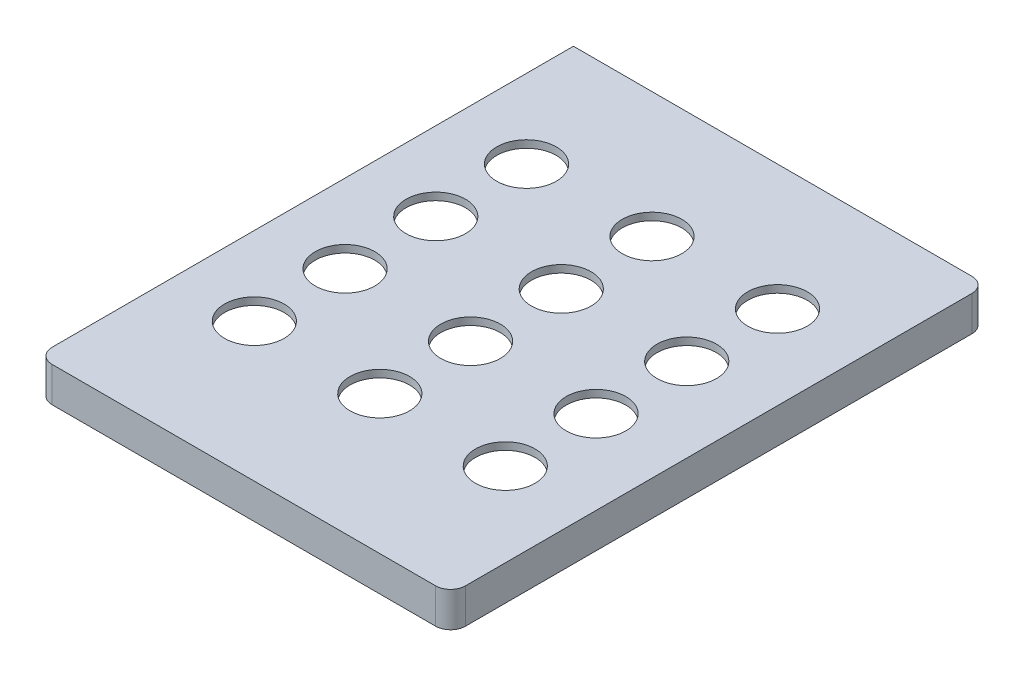
ISO-10303-21;
HEADER;
FILE_DESCRIPTION(('STEP AP214'),'2;1');
FILE_NAME('part.step','',(''),(''),'','','');
FILE_SCHEMA(('AUTOMOTIVE_DESIGN { 1 0 10303 214 1 1 1 1 }'));
ENDSEC;
DATA;
#1=APPLICATION_CONTEXT('core data for automotive mechanical design processes');
#2=APPLICATION_PROTOCOL_DEFINITION('international standard','automotive_design',2000,#1);
#3=PRODUCT_CONTEXT('',#1,'mechanical');
#4=PRODUCT('Part','Part','',(#3));
#5=PRODUCT_RELATED_PRODUCT_CATEGORY('part','',(#4));
#6=PRODUCT_DEFINITION_FORMATION('','',#4);
#7=PRODUCT_DEFINITION_CONTEXT('part definition',#1,'design');
#8=PRODUCT_DEFINITION('design','',#6,#7);
#9=PRODUCT_DEFINITION_SHAPE('','',#8);
#10=(LENGTH_UNIT() NAMED_UNIT(*) SI_UNIT(.MILLI.,.METRE.));
#11=(NAMED_UNIT(*) PLANE_ANGLE_UNIT() SI_UNIT($,.RADIAN.));
#12=(NAMED_UNIT(*) SI_UNIT($,.STERADIAN.) SOLID_ANGLE_UNIT());
#13=UNCERTAINTY_MEASURE_WITH_UNIT(LENGTH_MEASURE(1.E-05),#10,'distance_accuracy_value','');
#14=(GEOMETRIC_REPRESENTATION_CONTEXT(3) GLOBAL_UNCERTAINTY_ASSIGNED_CONTEXT((#13)) GLOBAL_UNIT_ASSIGNED_CONTEXT((#10,
#11,#12)) REPRESENTATION_CONTEXT('',''));
#15=CARTESIAN_POINT('',(0.,0.,0.));
#16=DIRECTION('',(0.,0.,1.));
#17=DIRECTION('',(1.,0.,0.));
#18=AXIS2_PLACEMENT_3D('',#15,#16,#17);
#19=CARTESIAN_POINT('',(25.75,12.5,-34.));
#20=DIRECTION('',(0.,1.,0.));
#21=DIRECTION('',(0.,0.,1.));
#22=AXIS2_PLACEMENT_3D('',#19,#20,#21);
#23=PLANE('',#22);
#24=CARTESIAN_POINT('',(25.75,12.5,-34.));
#25=DIRECTION('',(0.,1.,0.));
#26=DIRECTION('',(0.,0.,1.));
#27=AXIS2_PLACEMENT_3D('',#24,#25,#26);
#28=CIRCLE('',#27,2.);
#29=CARTESIAN_POINT('',(27.75,12.5,-34.));
#30=VERTEX_POINT('',#29);
#31=CARTESIAN_POINT('',(25.75,12.5,-36.));
#32=VERTEX_POINT('',#31);
#33=EDGE_CURVE('E194',#30,#32,#28,.T.);
#34=ORIENTED_EDGE('',*,*,#33,.F.);
#35=DIRECTION('',(0.,0.,-1.));
#36=VECTOR('',#35,1.);
#37=CARTESIAN_POINT('',(27.75,12.5,34.));
#38=LINE('',#37,#36);
#39=CARTESIAN_POINT('',(27.75,12.5,34.));
#40=VERTEX_POINT('',#39);
#41=EDGE_CURVE('E56',#40,#30,#38,.T.);
#42=ORIENTED_EDGE('',*,*,#41,.F.);
#43=CARTESIAN_POINT('',(25.75,12.5,34.));
#44=DIRECTION('',(0.,1.,0.));
#45=DIRECTION('',(0.,0.,1.));
#46=AXIS2_PLACEMENT_3D('',#43,#44,#45);
#47=CIRCLE('',#46,2.);
#48=CARTESIAN_POINT('',(25.75,12.5,36.));
#49=VERTEX_POINT('',#48);
#50=EDGE_CURVE('E205',#49,#40,#47,.T.);
#51=ORIENTED_EDGE('',*,*,#50,.F.);
#52=DIRECTION('',(1.,0.,0.));
#53=VECTOR('',#52,1.);
#54=CARTESIAN_POINT('',(-25.75,12.5,36.));
#55=LINE('',#54,#53);
#56=CARTESIAN_POINT('',(-25.75,12.5,36.));
#57=VERTEX_POINT('',#56);
#58=EDGE_CURVE('E203',#57,#49,#55,.T.);
#59=ORIENTED_EDGE('',*,*,#58,.F.);
#60=CARTESIAN_POINT('',(-25.75,12.5,34.));
#61=DIRECTION('',(0.,1.,0.));
#62=DIRECTION('',(0.,0.,1.));
#63=AXIS2_PLACEMENT_3D('',#60,#61,#62);
#64=CIRCLE('',#63,2.);
#65=CARTESIAN_POINT('',(-27.75,12.5,34.));
#66=VERTEX_POINT('',#65);
#67=EDGE_CURVE('E126',#66,#57,#64,.T.);
#68=ORIENTED_EDGE('',*,*,#67,.F.);
#69=DIRECTION('',(0.,0.,1.));
#70=VECTOR('',#69,1.);
#71=CARTESIAN_POINT('',(-27.75,12.5,-18.75));
#72=LINE('',#71,#70);
#73=CARTESIAN_POINT('',(-27.75,12.5,-36.));
#74=VERTEX_POINT('',#73);
#75=EDGE_CURVE('E200',#74,#66,#72,.T.);
#76=ORIENTED_EDGE('',*,*,#75,.F.);
#77=DIRECTION('',(-1.,0.,0.));
#78=VECTOR('',#77,1.);
#79=CARTESIAN_POINT('',(25.75,12.5,-36.));
#80=LINE('',#79,#78);
#81=EDGE_CURVE('E197',#32,#74,#80,.T.);
#82=ORIENTED_EDGE('',*,*,#81,.F.);
#83=EDGE_LOOP('',(#34,#42,#51,#59,#68,#76,#82));
#84=FACE_BOUND('',#83,.T.);
#85=DIRECTION('',(-1.,0.,0.));
#86=VECTOR('',#85,1.);
#87=CARTESIAN_POINT('',(-26.5,12.5,-34.));
#88=LINE('',#87,#86);
#89=CARTESIAN_POINT('',(25.45,12.5,-34.));
#90=VERTEX_POINT('',#89);
#91=CARTESIAN_POINT('',(-26.5,12.5,-34.));
#92=VERTEX_POINT('',#91);
#93=EDGE_CURVE('E48',#90,#92,#88,.T.);
#94=ORIENTED_EDGE('',*,*,#93,.T.);
#95=DIRECTION('',(0.,0.,1.));
#96=VECTOR('',#95,1.);
#97=CARTESIAN_POINT('',(-26.5,12.5,-34.));
#98=LINE('',#97,#96);
#99=CARTESIAN_POINT('',(-26.5,12.5,30.5));
#100=VERTEX_POINT('',#99);
#101=EDGE_CURVE('E179',#92,#100,#98,.T.);
#102=ORIENTED_EDGE('',*,*,#101,.T.);
#103=DIRECTION('',(1.,0.,0.));
#104=VECTOR('',#103,1.);
#105=CARTESIAN_POINT('',(25.45,12.5,30.5));
#106=LINE('',#105,#104);
#107=CARTESIAN_POINT('',(25.45,12.5,30.5));
#108=VERTEX_POINT('',#107);
#109=EDGE_CURVE('E182',#100,#108,#106,.T.);
#110=ORIENTED_EDGE('',*,*,#109,.T.);
#111=DIRECTION('',(0.,0.,-1.));
#112=VECTOR('',#111,1.);
#113=CARTESIAN_POINT('',(25.45,12.5,-34.));
#114=LINE('',#113,#112);
#115=EDGE_CURVE('E168',#108,#90,#114,.T.);
#116=ORIENTED_EDGE('',*,*,#115,.T.);
#117=EDGE_LOOP('',(#94,#102,#110,#116));
#118=FACE_BOUND('',#117,.T.);
#119=ADVANCED_FACE('F33',(#84,#118),#23,.F.);
#120=CARTESIAN_POINT('',(25.75,16.2,-34.));
#121=DIRECTION('',(0.,-1.,0.));
#122=DIRECTION('',(0.,0.,-1.));
#123=AXIS2_PLACEMENT_3D('',#120,#121,#122);
#124=CYLINDRICAL_SURFACE('',#123,2.);
#125=ORIENTED_EDGE('',*,*,#33,.T.);
#126=DIRECTION('',(0.,-1.,0.));
#127=VECTOR('',#126,1.);
#128=CARTESIAN_POINT('',(25.75,16.2,-36.));
#129=LINE('',#128,#127);
#130=CARTESIAN_POINT('',(25.75,17.2,-36.));
#131=VERTEX_POINT('',#130);
#132=EDGE_CURVE('E11',#131,#32,#129,.T.);
#133=ORIENTED_EDGE('',*,*,#132,.F.);
#134=CARTESIAN_POINT('',(25.75,17.2,-34.));
#135=DIRECTION('',(0.,1.,0.));
#136=DIRECTION('',(0.,0.,1.));
#137=AXIS2_PLACEMENT_3D('',#134,#135,#136);
#138=CIRCLE('',#137,2.);
#139=CARTESIAN_POINT('',(27.75,17.2,-34.));
#140=VERTEX_POINT('',#139);
#141=EDGE_CURVE('E158',#140,#131,#138,.T.);
#142=ORIENTED_EDGE('',*,*,#141,.F.);
#143=DIRECTION('',(0.,-1.,0.));
#144=VECTOR('',#143,1.);
#145=CARTESIAN_POINT('',(27.75,16.2,-34.));
#146=LINE('',#145,#144);
#147=EDGE_CURVE('E208',#140,#30,#146,.T.);
#148=ORIENTED_EDGE('',*,*,#147,.T.);
#149=EDGE_LOOP('',(#125,#133,#142,#148));
#150=FACE_BOUND('',#149,.T.);
#151=ADVANCED_FACE('F35',(#150),#124,.T.);
#152=CARTESIAN_POINT('',(25.75,16.2,-36.));
#153=DIRECTION('',(0.,0.,1.));
#154=DIRECTION('',(1.,0.,0.));
#155=AXIS2_PLACEMENT_3D('',#152,#153,#154);
#156=PLANE('',#155);
#157=ORIENTED_EDGE('',*,*,#81,.T.);
#158=DIRECTION('',(0.,-1.,0.));
#159=VECTOR('',#158,1.);
#160=CARTESIAN_POINT('',(-27.75,16.2,-36.));
#161=LINE('',#160,#159);
#162=CARTESIAN_POINT('',(-27.75,17.2,-36.));
#163=VERTEX_POINT('',#162);
#164=EDGE_CURVE('E41',#163,#74,#161,.T.);
#165=ORIENTED_EDGE('',*,*,#164,.F.);
#166=DIRECTION('',(-1.,0.,0.));
#167=VECTOR('',#166,1.);
#168=CARTESIAN_POINT('',(25.75,17.2,-36.));
#169=LINE('',#168,#167);
#170=EDGE_CURVE('E161',#131,#163,#169,.T.);
#171=ORIENTED_EDGE('',*,*,#170,.F.);
#172=ORIENTED_EDGE('',*,*,#132,.T.);
#173=EDGE_LOOP('',(#157,#165,#171,#172));
#174=FACE_BOUND('',#173,.T.);
#175=ADVANCED_FACE('F218',(#174),#156,.F.);
#176=CARTESIAN_POINT('',(-27.75,16.2,-18.75));
#177=DIRECTION('',(1.,0.,0.));
#178=DIRECTION('',(0.,0.,-1.));
#179=AXIS2_PLACEMENT_3D('',#176,#177,#178);
#180=PLANE('',#179);
#181=ORIENTED_EDGE('',*,*,#75,.T.);
#182=DIRECTION('',(0.,-1.,0.));
#183=VECTOR('',#182,1.);
#184=CARTESIAN_POINT('',(-27.75,16.2,34.));
#185=LINE('',#184,#183);
#186=CARTESIAN_POINT('',(-27.75,17.2,34.));
#187=VERTEX_POINT('',#186);
#188=EDGE_CURVE('E129',#187,#66,#185,.T.);
#189=ORIENTED_EDGE('',*,*,#188,.F.);
#190=DIRECTION('',(0.,0.,1.));
#191=VECTOR('',#190,1.);
#192=CARTESIAN_POINT('',(-27.75,17.2,-36.));
#193=LINE('',#192,#191);
#194=EDGE_CURVE('E146',#163,#187,#193,.T.);
#195=ORIENTED_EDGE('',*,*,#194,.F.);
#196=ORIENTED_EDGE('',*,*,#164,.T.);
#197=EDGE_LOOP('',(#181,#189,#195,#196));
#198=FACE_BOUND('',#197,.T.);
#199=ADVANCED_FACE('F215',(#198),#180,.F.);
#200=CARTESIAN_POINT('',(-25.75,16.2,34.));
#201=DIRECTION('',(0.,-1.,0.));
#202=DIRECTION('',(0.,0.,-1.));
#203=AXIS2_PLACEMENT_3D('',#200,#201,#202);
#204=CYLINDRICAL_SURFACE('',#203,2.);
#205=ORIENTED_EDGE('',*,*,#67,.T.);
#206=DIRECTION('',(0.,-1.,0.));
#207=VECTOR('',#206,1.);
#208=CARTESIAN_POINT('',(-25.75,16.2,36.));
#209=LINE('',#208,#207);
#210=CARTESIAN_POINT('',(-25.75,17.2,36.));
#211=VERTEX_POINT('',#210);
#212=EDGE_CURVE('E119',#211,#57,#209,.T.);
#213=ORIENTED_EDGE('',*,*,#212,.F.);
#214=CARTESIAN_POINT('',(-25.75,17.2,34.));
#215=DIRECTION('',(0.,1.,0.));
#216=DIRECTION('',(0.,0.,1.));
#217=AXIS2_PLACEMENT_3D('',#214,#215,#216);
#218=CIRCLE('',#217,2.);
#219=EDGE_CURVE('E124',#187,#211,#218,.T.);
#220=ORIENTED_EDGE('',*,*,#219,.F.);
#221=ORIENTED_EDGE('',*,*,#188,.T.);
#222=EDGE_LOOP('',(#205,#213,#220,#221));
#223=FACE_BOUND('',#222,.T.);
#224=ADVANCED_FACE('F121',(#223),#204,.T.);
#225=CARTESIAN_POINT('',(-25.75,16.2,36.));
#226=DIRECTION('',(0.,0.,-1.));
#227=DIRECTION('',(-1.,0.,0.));
#228=AXIS2_PLACEMENT_3D('',#225,#226,#227);
#229=PLANE('',#228);
#230=ORIENTED_EDGE('',*,*,#58,.T.);
#231=DIRECTION('',(0.,-1.,0.));
#232=VECTOR('',#231,1.);
#233=CARTESIAN_POINT('',(25.75,16.2,36.));
#234=LINE('',#233,#232);
#235=CARTESIAN_POINT('',(25.75,17.2,36.));
#236=VERTEX_POINT('',#235);
#237=EDGE_CURVE('E130',#236,#49,#234,.T.);
#238=ORIENTED_EDGE('',*,*,#237,.F.);
#239=DIRECTION('',(1.,0.,0.));
#240=VECTOR('',#239,1.);
#241=CARTESIAN_POINT('',(-25.75,17.2,36.));
#242=LINE('',#241,#240);
#243=EDGE_CURVE('E133',#211,#236,#242,.T.);
#244=ORIENTED_EDGE('',*,*,#243,.F.);
#245=ORIENTED_EDGE('',*,*,#212,.T.);
#246=EDGE_LOOP('',(#230,#238,#244,#245));
#247=FACE_BOUND('',#246,.T.);
#248=ADVANCED_FACE('F134',(#247),#229,.F.);
#249=CARTESIAN_POINT('',(25.75,16.2,34.));
#250=DIRECTION('',(0.,-1.,0.));
#251=DIRECTION('',(0.,0.,-1.));
#252=AXIS2_PLACEMENT_3D('',#249,#250,#251);
#253=CYLINDRICAL_SURFACE('',#252,2.);
#254=ORIENTED_EDGE('',*,*,#50,.T.);
#255=DIRECTION('',(0.,-1.,0.));
#256=VECTOR('',#255,1.);
#257=CARTESIAN_POINT('',(27.75,16.2,34.));
#258=LINE('',#257,#256);
#259=CARTESIAN_POINT('',(27.75,17.2,34.));
#260=VERTEX_POINT('',#259);
#261=EDGE_CURVE('E210',#260,#40,#258,.T.);
#262=ORIENTED_EDGE('',*,*,#261,.F.);
#263=CARTESIAN_POINT('',(25.75,17.2,34.));
#264=DIRECTION('',(0.,1.,0.));
#265=DIRECTION('',(0.,0.,1.));
#266=AXIS2_PLACEMENT_3D('',#263,#264,#265);
#267=CIRCLE('',#266,2.);
#268=EDGE_CURVE('E139',#236,#260,#267,.T.);
#269=ORIENTED_EDGE('',*,*,#268,.F.);
#270=ORIENTED_EDGE('',*,*,#237,.T.);
#271=EDGE_LOOP('',(#254,#262,#269,#270));
#272=FACE_BOUND('',#271,.T.);
#273=ADVANCED_FACE('F227',(#272),#253,.T.);
#274=CARTESIAN_POINT('',(27.75,16.2,34.));
#275=DIRECTION('',(-1.,0.,0.));
#276=DIRECTION('',(0.,0.,1.));
#277=AXIS2_PLACEMENT_3D('',#274,#275,#276);
#278=PLANE('',#277);
#279=ORIENTED_EDGE('',*,*,#41,.T.);
#280=ORIENTED_EDGE('',*,*,#147,.F.);
#281=DIRECTION('',(0.,0.,-1.));
#282=VECTOR('',#281,1.);
#283=CARTESIAN_POINT('',(27.75,17.2,34.));
#284=LINE('',#283,#282);
#285=EDGE_CURVE('E155',#260,#140,#284,.T.);
#286=ORIENTED_EDGE('',*,*,#285,.F.);
#287=ORIENTED_EDGE('',*,*,#261,.T.);
#288=EDGE_LOOP('',(#279,#280,#286,#287));
#289=FACE_BOUND('',#288,.T.);
#290=ADVANCED_FACE('F228',(#289),#278,.F.);
#291=CARTESIAN_POINT('',(-26.5,16.2,-34.));
#292=DIRECTION('',(0.,0.,1.));
#293=DIRECTION('',(1.,0.,0.));
#294=AXIS2_PLACEMENT_3D('',#291,#292,#293);
#295=PLANE('',#294);
#296=ORIENTED_EDGE('',*,*,#93,.F.);
#297=DIRECTION('',(0.,-1.,0.));
#298=VECTOR('',#297,1.);
#299=CARTESIAN_POINT('',(25.45,16.2,-34.));
#300=LINE('',#299,#298);
#301=CARTESIAN_POINT('',(25.45,16.2,-34.));
#302=VERTEX_POINT('',#301);
#303=EDGE_CURVE('E177',#302,#90,#300,.T.);
#304=ORIENTED_EDGE('',*,*,#303,.F.);
#305=DIRECTION('',(-1.,0.,0.));
#306=VECTOR('',#305,1.);
#307=CARTESIAN_POINT('',(-26.5,16.2,-34.));
#308=LINE('',#307,#306);
#309=CARTESIAN_POINT('',(-26.5,16.2,-34.));
#310=VERTEX_POINT('',#309);
#311=EDGE_CURVE('E164',#302,#310,#308,.T.);
#312=ORIENTED_EDGE('',*,*,#311,.T.);
#313=DIRECTION('',(0.,-1.,0.));
#314=VECTOR('',#313,1.);
#315=CARTESIAN_POINT('',(-26.5,16.2,-34.));
#316=LINE('',#315,#314);
#317=EDGE_CURVE('E192',#310,#92,#316,.T.);
#318=ORIENTED_EDGE('',*,*,#317,.T.);
#319=EDGE_LOOP('',(#296,#304,#312,#318));
#320=FACE_BOUND('',#319,.T.);
#321=ADVANCED_FACE('F230',(#320),#295,.T.);
#322=CARTESIAN_POINT('',(-26.5,16.2,-34.));
#323=DIRECTION('',(1.,0.,0.));
#324=DIRECTION('',(0.,0.,-1.));
#325=AXIS2_PLACEMENT_3D('',#322,#323,#324);
#326=PLANE('',#325);
#327=ORIENTED_EDGE('',*,*,#101,.F.);
#328=ORIENTED_EDGE('',*,*,#317,.F.);
#329=DIRECTION('',(0.,0.,1.));
#330=VECTOR('',#329,1.);
#331=CARTESIAN_POINT('',(-26.5,16.2,-34.));
#332=LINE('',#331,#330);
#333=CARTESIAN_POINT('',(-26.5,16.2,30.5));
#334=VERTEX_POINT('',#333);
#335=EDGE_CURVE('E167',#310,#334,#332,.T.);
#336=ORIENTED_EDGE('',*,*,#335,.T.);
#337=DIRECTION('',(0.,-1.,0.));
#338=VECTOR('',#337,1.);
#339=CARTESIAN_POINT('',(-26.5,16.2,30.5));
#340=LINE('',#339,#338);
#341=EDGE_CURVE('E190',#334,#100,#340,.T.);
#342=ORIENTED_EDGE('',*,*,#341,.T.);
#343=EDGE_LOOP('',(#327,#328,#336,#342));
#344=FACE_BOUND('',#343,.T.);
#345=ADVANCED_FACE('F236',(#344),#326,.T.);
#346=CARTESIAN_POINT('',(25.45,16.2,30.5));
#347=DIRECTION('',(0.,0.,-1.));
#348=DIRECTION('',(-1.,0.,0.));
#349=AXIS2_PLACEMENT_3D('',#346,#347,#348);
#350=PLANE('',#349);
#351=ORIENTED_EDGE('',*,*,#109,.F.);
#352=ORIENTED_EDGE('',*,*,#341,.F.);
#353=DIRECTION('',(1.,0.,0.));
#354=VECTOR('',#353,1.);
#355=CARTESIAN_POINT('',(25.45,16.2,30.5));
#356=LINE('',#355,#354);
#357=CARTESIAN_POINT('',(25.45,16.2,30.5));
#358=VERTEX_POINT('',#357);
#359=EDGE_CURVE('E171',#334,#358,#356,.T.);
#360=ORIENTED_EDGE('',*,*,#359,.T.);
#361=DIRECTION('',(0.,-1.,0.));
#362=VECTOR('',#361,1.);
#363=CARTESIAN_POINT('',(25.45,16.2,30.5));
#364=LINE('',#363,#362);
#365=EDGE_CURVE('E188',#358,#108,#364,.T.);
#366=ORIENTED_EDGE('',*,*,#365,.T.);
#367=EDGE_LOOP('',(#351,#352,#360,#366));
#368=FACE_BOUND('',#367,.T.);
#369=ADVANCED_FACE('F247',(#368),#350,.T.);
#370=CARTESIAN_POINT('',(25.45,16.2,-34.));
#371=DIRECTION('',(-1.,0.,0.));
#372=DIRECTION('',(0.,0.,1.));
#373=AXIS2_PLACEMENT_3D('',#370,#371,#372);
#374=PLANE('',#373);
#375=ORIENTED_EDGE('',*,*,#115,.F.);
#376=ORIENTED_EDGE('',*,*,#365,.F.);
#377=DIRECTION('',(0.,0.,-1.));
#378=VECTOR('',#377,1.);
#379=CARTESIAN_POINT('',(25.45,16.2,-34.));
#380=LINE('',#379,#378);
#381=EDGE_CURVE('E174',#358,#302,#380,.T.);
#382=ORIENTED_EDGE('',*,*,#381,.T.);
#383=ORIENTED_EDGE('',*,*,#303,.T.);
#384=EDGE_LOOP('',(#375,#376,#382,#383));
#385=FACE_BOUND('',#384,.T.);
#386=ADVANCED_FACE('F251',(#385),#374,.T.);
#387=CARTESIAN_POINT('',(-25.75,17.2,34.));
#388=DIRECTION('',(0.,1.,0.));
#389=DIRECTION('',(0.,0.,1.));
#390=AXIS2_PLACEMENT_3D('',#387,#388,#389);
#391=PLANE('',#390);
#392=CARTESIAN_POINT('',(16.5,17.2,-6.96666666666662));
#393=DIRECTION('',(0.,1.,0.));
#394=DIRECTION('',(0.,0.,1.));
#395=AXIS2_PLACEMENT_3D('',#392,#393,#394);
#396=CIRCLE('',#395,4.);
#397=CARTESIAN_POINT('',(16.5,17.2,-2.96666666666663));
#398=VERTEX_POINT('',#397);
#399=EDGE_CURVE('E324',#398,#398,#396,.T.);
#400=ORIENTED_EDGE('',*,*,#399,.F.);
#401=EDGE_LOOP('',(#400));
#402=FACE_BOUND('',#401,.T.);
#403=CARTESIAN_POINT('',(16.5,17.2,17.4));
#404=DIRECTION('',(0.,1.,0.));
#405=DIRECTION('',(0.,0.,1.));
#406=AXIS2_PLACEMENT_3D('',#403,#404,#405);
#407=CIRCLE('',#406,4.);
#408=CARTESIAN_POINT('',(16.5,17.2,21.4));
#409=VERTEX_POINT('',#408);
#410=EDGE_CURVE('E336',#409,#409,#407,.T.);
#411=ORIENTED_EDGE('',*,*,#410,.F.);
#412=EDGE_LOOP('',(#411));
#413=FACE_BOUND('',#412,.T.);
#414=CARTESIAN_POINT('',(-0.350000000000008,17.2,5.2166666666667));
#415=DIRECTION('',(0.,1.,0.));
#416=DIRECTION('',(0.,0.,1.));
#417=AXIS2_PLACEMENT_3D('',#414,#415,#416);
#418=CIRCLE('',#417,4.);
#419=CARTESIAN_POINT('',(-0.350000000000008,17.2,9.2166666666667));
#420=VERTEX_POINT('',#419);
#421=EDGE_CURVE('E348',#420,#420,#418,.T.);
#422=ORIENTED_EDGE('',*,*,#421,.F.);
#423=EDGE_LOOP('',(#422));
#424=FACE_BOUND('',#423,.T.);
#425=CARTESIAN_POINT('',(-0.350000000000007,17.2,-19.15));
#426=DIRECTION('',(0.,1.,0.));
#427=DIRECTION('',(0.,0.,1.));
#428=AXIS2_PLACEMENT_3D('',#425,#426,#427);
#429=CIRCLE('',#428,4.);
#430=CARTESIAN_POINT('',(-0.350000000000007,17.2,-15.15));
#431=VERTEX_POINT('',#430);
#432=EDGE_CURVE('E360',#431,#431,#429,.T.);
#433=ORIENTED_EDGE('',*,*,#432,.F.);
#434=EDGE_LOOP('',(#433));
#435=FACE_BOUND('',#434,.T.);
#436=CARTESIAN_POINT('',(-17.2,17.2,-6.96666666666662));
#437=DIRECTION('',(0.,1.,0.));
#438=DIRECTION('',(0.,0.,1.));
#439=AXIS2_PLACEMENT_3D('',#436,#437,#438);
#440=CIRCLE('',#439,4.);
#441=CARTESIAN_POINT('',(-17.2,17.2,-2.96666666666662));
#442=VERTEX_POINT('',#441);
#443=EDGE_CURVE('E372',#442,#442,#440,.T.);
#444=ORIENTED_EDGE('',*,*,#443,.F.);
#445=EDGE_LOOP('',(#444));
#446=FACE_BOUND('',#445,.T.);
#447=CARTESIAN_POINT('',(-17.2,17.2,17.4));
#448=DIRECTION('',(0.,1.,0.));
#449=DIRECTION('',(0.,0.,1.));
#450=AXIS2_PLACEMENT_3D('',#447,#448,#449);
#451=CIRCLE('',#450,4.);
#452=CARTESIAN_POINT('',(-17.2,17.2,21.4));
#453=VERTEX_POINT('',#452);
#454=EDGE_CURVE('E147',#453,#453,#451,.T.);
#455=ORIENTED_EDGE('',*,*,#454,.F.);
#456=EDGE_LOOP('',(#455));
#457=FACE_BOUND('',#456,.T.);
#458=ORIENTED_EDGE('',*,*,#219,.T.);
#459=ORIENTED_EDGE('',*,*,#243,.T.);
#460=ORIENTED_EDGE('',*,*,#268,.T.);
#461=ORIENTED_EDGE('',*,*,#285,.T.);
#462=ORIENTED_EDGE('',*,*,#141,.T.);
#463=ORIENTED_EDGE('',*,*,#170,.T.);
#464=ORIENTED_EDGE('',*,*,#194,.T.);
#465=EDGE_LOOP('',(#458,#459,#460,#461,#462,#463,#464));
#466=FACE_BOUND('',#465,.T.);
#467=CARTESIAN_POINT('',(-17.2,17.2,5.21666666666671));
#468=DIRECTION('',(0.,1.,0.));
#469=DIRECTION('',(0.,0.,1.));
#470=AXIS2_PLACEMENT_3D('',#467,#468,#469);
#471=CIRCLE('',#470,4.);
#472=CARTESIAN_POINT('',(-17.2,17.2,9.21666666666671));
#473=VERTEX_POINT('',#472);
#474=EDGE_CURVE('E378',#473,#473,#471,.T.);
#475=ORIENTED_EDGE('',*,*,#474,.F.);
#476=EDGE_LOOP('',(#475));
#477=FACE_BOUND('',#476,.T.);
#478=CARTESIAN_POINT('',(-17.2,17.2,-19.15));
#479=DIRECTION('',(0.,1.,0.));
#480=DIRECTION('',(0.,0.,1.));
#481=AXIS2_PLACEMENT_3D('',#478,#479,#480);
#482=CIRCLE('',#481,4.);
#483=CARTESIAN_POINT('',(-17.2,17.2,-15.15));
#484=VERTEX_POINT('',#483);
#485=EDGE_CURVE('E366',#484,#484,#482,.T.);
#486=ORIENTED_EDGE('',*,*,#485,.F.);
#487=EDGE_LOOP('',(#486));
#488=FACE_BOUND('',#487,.T.);
#489=CARTESIAN_POINT('',(-0.350000000000007,17.2,-6.96666666666663));
#490=DIRECTION('',(0.,1.,0.));
#491=DIRECTION('',(0.,0.,1.));
#492=AXIS2_PLACEMENT_3D('',#489,#490,#491);
#493=CIRCLE('',#492,4.);
#494=CARTESIAN_POINT('',(-0.350000000000007,17.2,-2.96666666666663));
#495=VERTEX_POINT('',#494);
#496=EDGE_CURVE('E354',#495,#495,#493,.T.);
#497=ORIENTED_EDGE('',*,*,#496,.F.);
#498=EDGE_LOOP('',(#497));
#499=FACE_BOUND('',#498,.T.);
#500=CARTESIAN_POINT('',(-0.350000000000008,17.2,17.4));
#501=DIRECTION('',(0.,1.,0.));
#502=DIRECTION('',(0.,0.,1.));
#503=AXIS2_PLACEMENT_3D('',#500,#501,#502);
#504=CIRCLE('',#503,4.);
#505=CARTESIAN_POINT('',(-0.350000000000008,17.2,21.4));
#506=VERTEX_POINT('',#505);
#507=EDGE_CURVE('E342',#506,#506,#504,.T.);
#508=ORIENTED_EDGE('',*,*,#507,.F.);
#509=EDGE_LOOP('',(#508));
#510=FACE_BOUND('',#509,.T.);
#511=CARTESIAN_POINT('',(16.5,17.2,5.2166666666667));
#512=DIRECTION('',(0.,1.,0.));
#513=DIRECTION('',(0.,0.,1.));
#514=AXIS2_PLACEMENT_3D('',#511,#512,#513);
#515=CIRCLE('',#514,4.);
#516=CARTESIAN_POINT('',(16.5,17.2,9.2166666666667));
#517=VERTEX_POINT('',#516);
#518=EDGE_CURVE('E330',#517,#517,#515,.T.);
#519=ORIENTED_EDGE('',*,*,#518,.F.);
#520=EDGE_LOOP('',(#519));
#521=FACE_BOUND('',#520,.T.);
#522=CARTESIAN_POINT('',(16.5,17.2,-19.15));
#523=DIRECTION('',(0.,1.,0.));
#524=DIRECTION('',(0.,0.,1.));
#525=AXIS2_PLACEMENT_3D('',#522,#523,#524);
#526=CIRCLE('',#525,4.);
#527=CARTESIAN_POINT('',(16.5,17.2,-15.15));
#528=VERTEX_POINT('',#527);
#529=EDGE_CURVE('E315',#528,#528,#526,.T.);
#530=ORIENTED_EDGE('',*,*,#529,.F.);
#531=EDGE_LOOP('',(#530));
#532=FACE_BOUND('',#531,.T.);
#533=ADVANCED_FACE('F142',(#402,#413,#424,#435,#446,#457,#466,#477,#488,#499,#510,#521,#532),
#391,.T.);
#534=CARTESIAN_POINT('',(-25.75,16.2,34.));
#535=DIRECTION('',(0.,1.,0.));
#536=DIRECTION('',(0.,0.,1.));
#537=AXIS2_PLACEMENT_3D('',#534,#535,#536);
#538=PLANE('',#537);
#539=ORIENTED_EDGE('',*,*,#311,.F.);
#540=ORIENTED_EDGE('',*,*,#381,.F.);
#541=ORIENTED_EDGE('',*,*,#359,.F.);
#542=ORIENTED_EDGE('',*,*,#335,.F.);
#543=EDGE_LOOP('',(#539,#540,#541,#542));
#544=FACE_BOUND('',#543,.T.);
#545=CARTESIAN_POINT('',(16.5,16.2,-6.96666666666662));
#546=DIRECTION('',(0.,1.,0.));
#547=DIRECTION('',(0.,0.,1.));
#548=AXIS2_PLACEMENT_3D('',#545,#546,#547);
#549=CIRCLE('',#548,4.);
#550=CARTESIAN_POINT('',(16.5,16.2,-2.96666666666663));
#551=VERTEX_POINT('',#550);
#552=EDGE_CURVE('E321',#551,#551,#549,.T.);
#553=ORIENTED_EDGE('',*,*,#552,.T.);
#554=EDGE_LOOP('',(#553));
#555=FACE_BOUND('',#554,.T.);
#556=CARTESIAN_POINT('',(16.5,16.2,17.4));
#557=DIRECTION('',(0.,1.,0.));
#558=DIRECTION('',(0.,0.,1.));
#559=AXIS2_PLACEMENT_3D('',#556,#557,#558);
#560=CIRCLE('',#559,4.);
#561=CARTESIAN_POINT('',(16.5,16.2,21.4));
#562=VERTEX_POINT('',#561);
#563=EDGE_CURVE('E333',#562,#562,#560,.T.);
#564=ORIENTED_EDGE('',*,*,#563,.T.);
#565=EDGE_LOOP('',(#564));
#566=FACE_BOUND('',#565,.T.);
#567=CARTESIAN_POINT('',(-0.350000000000008,16.2,5.2166666666667));
#568=DIRECTION('',(0.,1.,0.));
#569=DIRECTION('',(0.,0.,1.));
#570=AXIS2_PLACEMENT_3D('',#567,#568,#569);
#571=CIRCLE('',#570,4.);
#572=CARTESIAN_POINT('',(-0.350000000000008,16.2,9.2166666666667));
#573=VERTEX_POINT('',#572);
#574=EDGE_CURVE('E345',#573,#573,#571,.T.);
#575=ORIENTED_EDGE('',*,*,#574,.T.);
#576=EDGE_LOOP('',(#575));
#577=FACE_BOUND('',#576,.T.);
#578=CARTESIAN_POINT('',(-0.350000000000007,16.2,-19.15));
#579=DIRECTION('',(0.,1.,0.));
#580=DIRECTION('',(0.,0.,1.));
#581=AXIS2_PLACEMENT_3D('',#578,#579,#580);
#582=CIRCLE('',#581,4.);
#583=CARTESIAN_POINT('',(-0.350000000000007,16.2,-15.15));
#584=VERTEX_POINT('',#583);
#585=EDGE_CURVE('E357',#584,#584,#582,.T.);
#586=ORIENTED_EDGE('',*,*,#585,.T.);
#587=EDGE_LOOP('',(#586));
#588=FACE_BOUND('',#587,.T.);
#589=CARTESIAN_POINT('',(-17.2,16.2,-6.96666666666662));
#590=DIRECTION('',(0.,1.,0.));
#591=DIRECTION('',(0.,0.,1.));
#592=AXIS2_PLACEMENT_3D('',#589,#590,#591);
#593=CIRCLE('',#592,4.);
#594=CARTESIAN_POINT('',(-17.2,16.2,-2.96666666666662));
#595=VERTEX_POINT('',#594);
#596=EDGE_CURVE('E369',#595,#595,#593,.T.);
#597=ORIENTED_EDGE('',*,*,#596,.T.);
#598=EDGE_LOOP('',(#597));
#599=FACE_BOUND('',#598,.T.);
#600=CARTESIAN_POINT('',(-17.2,16.2,17.4));
#601=DIRECTION('',(0.,1.,0.));
#602=DIRECTION('',(0.,0.,1.));
#603=AXIS2_PLACEMENT_3D('',#600,#601,#602);
#604=CIRCLE('',#603,4.);
#605=CARTESIAN_POINT('',(-17.2,16.2,21.4));
#606=VERTEX_POINT('',#605);
#607=EDGE_CURVE('E150',#606,#606,#604,.T.);
#608=ORIENTED_EDGE('',*,*,#607,.T.);
#609=EDGE_LOOP('',(#608));
#610=FACE_BOUND('',#609,.T.);
#611=CARTESIAN_POINT('',(-17.2,16.2,5.21666666666671));
#612=DIRECTION('',(0.,1.,0.));
#613=DIRECTION('',(0.,0.,1.));
#614=AXIS2_PLACEMENT_3D('',#611,#612,#613);
#615=CIRCLE('',#614,4.);
#616=CARTESIAN_POINT('',(-17.2,16.2,9.21666666666671));
#617=VERTEX_POINT('',#616);
#618=EDGE_CURVE('E375',#617,#617,#615,.T.);
#619=ORIENTED_EDGE('',*,*,#618,.T.);
#620=EDGE_LOOP('',(#619));
#621=FACE_BOUND('',#620,.T.);
#622=CARTESIAN_POINT('',(-17.2,16.2,-19.15));
#623=DIRECTION('',(0.,1.,0.));
#624=DIRECTION('',(0.,0.,1.));
#625=AXIS2_PLACEMENT_3D('',#622,#623,#624);
#626=CIRCLE('',#625,4.);
#627=CARTESIAN_POINT('',(-17.2,16.2,-15.15));
#628=VERTEX_POINT('',#627);
#629=EDGE_CURVE('E363',#628,#628,#626,.T.);
#630=ORIENTED_EDGE('',*,*,#629,.T.);
#631=EDGE_LOOP('',(#630));
#632=FACE_BOUND('',#631,.T.);
#633=CARTESIAN_POINT('',(-0.350000000000007,16.2,-6.96666666666663));
#634=DIRECTION('',(0.,1.,0.));
#635=DIRECTION('',(0.,0.,1.));
#636=AXIS2_PLACEMENT_3D('',#633,#634,#635);
#637=CIRCLE('',#636,4.);
#638=CARTESIAN_POINT('',(-0.350000000000007,16.2,-2.96666666666663));
#639=VERTEX_POINT('',#638);
#640=EDGE_CURVE('E351',#639,#639,#637,.T.);
#641=ORIENTED_EDGE('',*,*,#640,.T.);
#642=EDGE_LOOP('',(#641));
#643=FACE_BOUND('',#642,.T.);
#644=CARTESIAN_POINT('',(-0.350000000000008,16.2,17.4));
#645=DIRECTION('',(0.,1.,0.));
#646=DIRECTION('',(0.,0.,1.));
#647=AXIS2_PLACEMENT_3D('',#644,#645,#646);
#648=CIRCLE('',#647,4.);
#649=CARTESIAN_POINT('',(-0.350000000000008,16.2,21.4));
#650=VERTEX_POINT('',#649);
#651=EDGE_CURVE('E339',#650,#650,#648,.T.);
#652=ORIENTED_EDGE('',*,*,#651,.T.);
#653=EDGE_LOOP('',(#652));
#654=FACE_BOUND('',#653,.T.);
#655=CARTESIAN_POINT('',(16.5,16.2,5.2166666666667));
#656=DIRECTION('',(0.,1.,0.));
#657=DIRECTION('',(0.,0.,1.));
#658=AXIS2_PLACEMENT_3D('',#655,#656,#657);
#659=CIRCLE('',#658,4.);
#660=CARTESIAN_POINT('',(16.5,16.2,9.2166666666667));
#661=VERTEX_POINT('',#660);
#662=EDGE_CURVE('E327',#661,#661,#659,.T.);
#663=ORIENTED_EDGE('',*,*,#662,.T.);
#664=EDGE_LOOP('',(#663));
#665=FACE_BOUND('',#664,.T.);
#666=CARTESIAN_POINT('',(16.5,16.2,-19.15));
#667=DIRECTION('',(0.,1.,0.));
#668=DIRECTION('',(0.,0.,1.));
#669=AXIS2_PLACEMENT_3D('',#666,#667,#668);
#670=CIRCLE('',#669,4.);
#671=CARTESIAN_POINT('',(16.5,16.2,-15.15));
#672=VERTEX_POINT('',#671);
#673=EDGE_CURVE('E318',#672,#672,#670,.T.);
#674=ORIENTED_EDGE('',*,*,#673,.T.);
#675=EDGE_LOOP('',(#674));
#676=FACE_BOUND('',#675,.T.);
#677=ADVANCED_FACE('F256',(#544,#555,#566,#577,#588,#599,#610,#621,#632,#643,#654,#665,#676),
#538,.F.);
#678=CARTESIAN_POINT('',(-17.2,17.2,17.4));
#679=DIRECTION('',(0.,-1.,0.));
#680=DIRECTION('',(0.,0.,-1.));
#681=AXIS2_PLACEMENT_3D('',#678,#679,#680);
#682=CYLINDRICAL_SURFACE('',#681,4.);
#683=ORIENTED_EDGE('',*,*,#454,.T.);
#684=EDGE_LOOP('',(#683));
#685=FACE_BOUND('',#684,.T.);
#686=ORIENTED_EDGE('',*,*,#607,.F.);
#687=EDGE_LOOP('',(#686));
#688=FACE_BOUND('',#687,.T.);
#689=ADVANCED_FACE('F259',(#685,#688),#682,.F.);
#690=CARTESIAN_POINT('',(-17.2,17.2,5.21666666666671));
#691=DIRECTION('',(0.,-1.,0.));
#692=DIRECTION('',(0.,0.,-1.));
#693=AXIS2_PLACEMENT_3D('',#690,#691,#692);
#694=CYLINDRICAL_SURFACE('',#693,4.);
#695=ORIENTED_EDGE('',*,*,#474,.T.);
#696=EDGE_LOOP('',(#695));
#697=FACE_BOUND('',#696,.T.);
#698=ORIENTED_EDGE('',*,*,#618,.F.);
#699=EDGE_LOOP('',(#698));
#700=FACE_BOUND('',#699,.T.);
#701=ADVANCED_FACE('F266',(#697,#700),#694,.F.);
#702=CARTESIAN_POINT('',(-17.2,17.2,-6.96666666666662));
#703=DIRECTION('',(0.,-1.,0.));
#704=DIRECTION('',(0.,0.,-1.));
#705=AXIS2_PLACEMENT_3D('',#702,#703,#704);
#706=CYLINDRICAL_SURFACE('',#705,4.);
#707=ORIENTED_EDGE('',*,*,#443,.T.);
#708=EDGE_LOOP('',(#707));
#709=FACE_BOUND('',#708,.T.);
#710=ORIENTED_EDGE('',*,*,#596,.F.);
#711=EDGE_LOOP('',(#710));
#712=FACE_BOUND('',#711,.T.);
#713=ADVANCED_FACE('F270',(#709,#712),#706,.F.);
#714=CARTESIAN_POINT('',(-17.2,17.2,-19.15));
#715=DIRECTION('',(0.,-1.,0.));
#716=DIRECTION('',(0.,0.,-1.));
#717=AXIS2_PLACEMENT_3D('',#714,#715,#716);
#718=CYLINDRICAL_SURFACE('',#717,4.);
#719=ORIENTED_EDGE('',*,*,#485,.T.);
#720=EDGE_LOOP('',(#719));
#721=FACE_BOUND('',#720,.T.);
#722=ORIENTED_EDGE('',*,*,#629,.F.);
#723=EDGE_LOOP('',(#722));
#724=FACE_BOUND('',#723,.T.);
#725=ADVANCED_FACE('F274',(#721,#724),#718,.F.);
#726=CARTESIAN_POINT('',(-0.350000000000007,17.2,-19.15));
#727=DIRECTION('',(0.,-1.,0.));
#728=DIRECTION('',(0.,0.,-1.));
#729=AXIS2_PLACEMENT_3D('',#726,#727,#728);
#730=CYLINDRICAL_SURFACE('',#729,4.);
#731=ORIENTED_EDGE('',*,*,#432,.T.);
#732=EDGE_LOOP('',(#731));
#733=FACE_BOUND('',#732,.T.);
#734=ORIENTED_EDGE('',*,*,#585,.F.);
#735=EDGE_LOOP('',(#734));
#736=FACE_BOUND('',#735,.T.);
#737=ADVANCED_FACE('F278',(#733,#736),#730,.F.);
#738=CARTESIAN_POINT('',(-0.350000000000007,17.2,-6.96666666666663));
#739=DIRECTION('',(0.,-1.,0.));
#740=DIRECTION('',(0.,0.,-1.));
#741=AXIS2_PLACEMENT_3D('',#738,#739,#740);
#742=CYLINDRICAL_SURFACE('',#741,4.);
#743=ORIENTED_EDGE('',*,*,#496,.T.);
#744=EDGE_LOOP('',(#743));
#745=FACE_BOUND('',#744,.T.);
#746=ORIENTED_EDGE('',*,*,#640,.F.);
#747=EDGE_LOOP('',(#746));
#748=FACE_BOUND('',#747,.T.);
#749=ADVANCED_FACE('F282',(#745,#748),#742,.F.);
#750=CARTESIAN_POINT('',(-0.350000000000008,17.2,5.2166666666667));
#751=DIRECTION('',(0.,-1.,0.));
#752=DIRECTION('',(0.,0.,-1.));
#753=AXIS2_PLACEMENT_3D('',#750,#751,#752);
#754=CYLINDRICAL_SURFACE('',#753,4.);
#755=ORIENTED_EDGE('',*,*,#421,.T.);
#756=EDGE_LOOP('',(#755));
#757=FACE_BOUND('',#756,.T.);
#758=ORIENTED_EDGE('',*,*,#574,.F.);
#759=EDGE_LOOP('',(#758));
#760=FACE_BOUND('',#759,.T.);
#761=ADVANCED_FACE('F286',(#757,#760),#754,.F.);
#762=CARTESIAN_POINT('',(-0.350000000000008,17.2,17.4));
#763=DIRECTION('',(0.,-1.,0.));
#764=DIRECTION('',(0.,0.,-1.));
#765=AXIS2_PLACEMENT_3D('',#762,#763,#764);
#766=CYLINDRICAL_SURFACE('',#765,4.);
#767=ORIENTED_EDGE('',*,*,#507,.T.);
#768=EDGE_LOOP('',(#767));
#769=FACE_BOUND('',#768,.T.);
#770=ORIENTED_EDGE('',*,*,#651,.F.);
#771=EDGE_LOOP('',(#770));
#772=FACE_BOUND('',#771,.T.);
#773=ADVANCED_FACE('F290',(#769,#772),#766,.F.);
#774=CARTESIAN_POINT('',(16.5,17.2,17.4));
#775=DIRECTION('',(0.,-1.,0.));
#776=DIRECTION('',(0.,0.,-1.));
#777=AXIS2_PLACEMENT_3D('',#774,#775,#776);
#778=CYLINDRICAL_SURFACE('',#777,4.);
#779=ORIENTED_EDGE('',*,*,#410,.T.);
#780=EDGE_LOOP('',(#779));
#781=FACE_BOUND('',#780,.T.);
#782=ORIENTED_EDGE('',*,*,#563,.F.);
#783=EDGE_LOOP('',(#782));
#784=FACE_BOUND('',#783,.T.);
#785=ADVANCED_FACE('F294',(#781,#784),#778,.F.);
#786=CARTESIAN_POINT('',(16.5,17.2,5.2166666666667));
#787=DIRECTION('',(0.,-1.,0.));
#788=DIRECTION('',(0.,0.,-1.));
#789=AXIS2_PLACEMENT_3D('',#786,#787,#788);
#790=CYLINDRICAL_SURFACE('',#789,4.);
#791=ORIENTED_EDGE('',*,*,#518,.T.);
#792=EDGE_LOOP('',(#791));
#793=FACE_BOUND('',#792,.T.);
#794=ORIENTED_EDGE('',*,*,#662,.F.);
#795=EDGE_LOOP('',(#794));
#796=FACE_BOUND('',#795,.T.);
#797=ADVANCED_FACE('F298',(#793,#796),#790,.F.);
#798=CARTESIAN_POINT('',(16.5,17.2,-6.96666666666662));
#799=DIRECTION('',(0.,-1.,0.));
#800=DIRECTION('',(0.,0.,-1.));
#801=AXIS2_PLACEMENT_3D('',#798,#799,#800);
#802=CYLINDRICAL_SURFACE('',#801,4.);
#803=ORIENTED_EDGE('',*,*,#399,.T.);
#804=EDGE_LOOP('',(#803));
#805=FACE_BOUND('',#804,.T.);
#806=ORIENTED_EDGE('',*,*,#552,.F.);
#807=EDGE_LOOP('',(#806));
#808=FACE_BOUND('',#807,.T.);
#809=ADVANCED_FACE('F302',(#805,#808),#802,.F.);
#810=CARTESIAN_POINT('',(16.5,17.2,-19.15));
#811=DIRECTION('',(0.,-1.,0.));
#812=DIRECTION('',(0.,0.,-1.));
#813=AXIS2_PLACEMENT_3D('',#810,#811,#812);
#814=CYLINDRICAL_SURFACE('',#813,4.);
#815=ORIENTED_EDGE('',*,*,#529,.T.);
#816=EDGE_LOOP('',(#815));
#817=FACE_BOUND('',#816,.T.);
#818=ORIENTED_EDGE('',*,*,#673,.F.);
#819=EDGE_LOOP('',(#818));
#820=FACE_BOUND('',#819,.T.);
#821=ADVANCED_FACE('F306',(#817,#820),#814,.F.);
#822=CLOSED_SHELL('',(#119,#151,#175,#199,#224,#248,#273,#290,#321,#345,#369,#386,#533,#677,
#689,#701,#713,#725,#737,#749,#761,#773,#785,#797,#809,#821));
#823=MANIFOLD_SOLID_BREP('B2',#822);
#824=ADVANCED_BREP_SHAPE_REPRESENTATION('',(#18,#823),#14);
#825=SHAPE_DEFINITION_REPRESENTATION(#9,#824);
ENDSEC;
END-ISO-10303-21;
